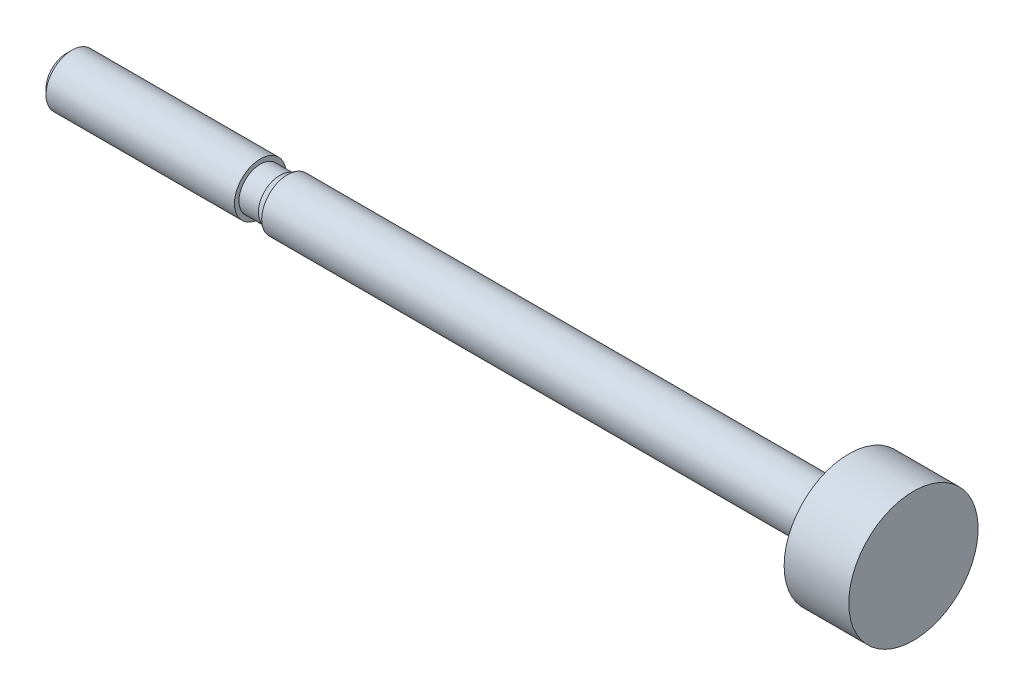
ISO-10303-21;
HEADER;
FILE_DESCRIPTION(('STEP AP214'),'2;1');
FILE_NAME('part.step','',(''),(''),'','','');
FILE_SCHEMA(('AUTOMOTIVE_DESIGN { 1 0 10303 214 1 1 1 1 }'));
ENDSEC;
DATA;
#1=APPLICATION_CONTEXT('core data for automotive mechanical design processes');
#2=APPLICATION_PROTOCOL_DEFINITION('international standard','automotive_design',2000,#1);
#3=PRODUCT_CONTEXT('',#1,'mechanical');
#4=PRODUCT('Part','Part','',(#3));
#5=PRODUCT_RELATED_PRODUCT_CATEGORY('part','',(#4));
#6=PRODUCT_DEFINITION_FORMATION('','',#4);
#7=PRODUCT_DEFINITION_CONTEXT('part definition',#1,'design');
#8=PRODUCT_DEFINITION('design','',#6,#7);
#9=PRODUCT_DEFINITION_SHAPE('','',#8);
#10=(LENGTH_UNIT() NAMED_UNIT(*) SI_UNIT(.MILLI.,.METRE.));
#11=(NAMED_UNIT(*) PLANE_ANGLE_UNIT() SI_UNIT($,.RADIAN.));
#12=(NAMED_UNIT(*) SI_UNIT($,.STERADIAN.) SOLID_ANGLE_UNIT());
#13=UNCERTAINTY_MEASURE_WITH_UNIT(LENGTH_MEASURE(1.E-05),#10,'distance_accuracy_value','');
#14=(GEOMETRIC_REPRESENTATION_CONTEXT(3) GLOBAL_UNCERTAINTY_ASSIGNED_CONTEXT((#13)) GLOBAL_UNIT_ASSIGNED_CONTEXT((#10,
#11,#12)) REPRESENTATION_CONTEXT('',''));
#15=CARTESIAN_POINT('',(0.,0.,0.));
#16=DIRECTION('',(0.,0.,1.));
#17=DIRECTION('',(1.,0.,0.));
#18=AXIS2_PLACEMENT_3D('',#15,#16,#17);
#19=CARTESIAN_POINT('',(0.,0.,0.));
#20=DIRECTION('',(1.,0.,0.));
#21=DIRECTION('',(0.,0.,-1.));
#22=AXIS2_PLACEMENT_3D('',#19,#20,#21);
#23=PLANE('',#22);
#24=CARTESIAN_POINT('',(0.,0.,0.));
#25=DIRECTION('',(-1.,0.,0.));
#26=DIRECTION('',(0.,0.,1.));
#27=AXIS2_PLACEMENT_3D('',#24,#25,#26);
#28=CIRCLE('',#27,1.5705);
#29=CARTESIAN_POINT('',(0.,0.,1.5705));
#30=VERTEX_POINT('',#29);
#31=EDGE_CURVE('E10',#30,#30,#28,.T.);
#32=ORIENTED_EDGE('',*,*,#31,.T.);
#33=EDGE_LOOP('',(#32));
#34=FACE_BOUND('',#33,.T.);
#35=ADVANCED_FACE('F34',(#34),#23,.F.);
#36=CARTESIAN_POINT('',(0.429499999999999,0.,0.));
#37=DIRECTION('',(1.,0.,0.));
#38=DIRECTION('',(0.,0.,-1.));
#39=AXIS2_PLACEMENT_3D('',#36,#37,#38);
#40=CONICAL_SURFACE('',#39,2.,0.785398163397449);
#41=ORIENTED_EDGE('',*,*,#31,.F.);
#42=EDGE_LOOP('',(#41));
#43=FACE_BOUND('',#42,.T.);
#44=CARTESIAN_POINT('',(0.429499999999999,0.,0.));
#45=DIRECTION('',(-1.,0.,0.));
#46=DIRECTION('',(0.,0.,1.));
#47=AXIS2_PLACEMENT_3D('',#44,#45,#46);
#48=CIRCLE('',#47,2.);
#49=CARTESIAN_POINT('',(0.429499999999999,0.,2.));
#50=VERTEX_POINT('',#49);
#51=EDGE_CURVE('E40',#50,#50,#48,.T.);
#52=ORIENTED_EDGE('',*,*,#51,.T.);
#53=EDGE_LOOP('',(#52));
#54=FACE_BOUND('',#53,.T.);
#55=ADVANCED_FACE('F81',(#43,#54),#40,.T.);
#56=CARTESIAN_POINT('',(65.5,0.,0.));
#57=DIRECTION('',(-1.,0.,0.));
#58=DIRECTION('',(0.,0.,1.));
#59=AXIS2_PLACEMENT_3D('',#56,#57,#58);
#60=CYLINDRICAL_SURFACE('',#59,2.);
#61=ORIENTED_EDGE('',*,*,#51,.F.);
#62=EDGE_LOOP('',(#61));
#63=FACE_BOUND('',#62,.T.);
#64=CARTESIAN_POINT('',(15.,0.,0.));
#65=DIRECTION('',(-1.,0.,0.));
#66=DIRECTION('',(0.,0.,1.));
#67=AXIS2_PLACEMENT_3D('',#64,#65,#66);
#68=CIRCLE('',#67,2.);
#69=CARTESIAN_POINT('',(15.,0.,2.));
#70=VERTEX_POINT('',#69);
#71=EDGE_CURVE('E44',#70,#70,#68,.T.);
#72=ORIENTED_EDGE('',*,*,#71,.T.);
#73=EDGE_LOOP('',(#72));
#74=FACE_BOUND('',#73,.T.);
#75=ADVANCED_FACE('F85',(#63,#74),#60,.T.);
#76=CARTESIAN_POINT('',(15.,2.,0.));
#77=DIRECTION('',(-1.,0.,0.));
#78=DIRECTION('',(0.,0.,1.));
#79=AXIS2_PLACEMENT_3D('',#76,#77,#78);
#80=PLANE('',#79);
#81=ORIENTED_EDGE('',*,*,#71,.F.);
#82=EDGE_LOOP('',(#81));
#83=FACE_BOUND('',#82,.T.);
#84=CARTESIAN_POINT('',(15.,0.,0.));
#85=DIRECTION('',(-1.,0.,0.));
#86=DIRECTION('',(0.,0.,1.));
#87=AXIS2_PLACEMENT_3D('',#84,#85,#86);
#88=CIRCLE('',#87,1.65);
#89=CARTESIAN_POINT('',(15.,0.,1.65));
#90=VERTEX_POINT('',#89);
#91=EDGE_CURVE('E48',#90,#90,#88,.T.);
#92=ORIENTED_EDGE('',*,*,#91,.T.);
#93=EDGE_LOOP('',(#92));
#94=FACE_BOUND('',#93,.T.);
#95=ADVANCED_FACE('F90',(#83,#94),#80,.F.);
#96=CARTESIAN_POINT('',(65.5,0.,0.));
#97=DIRECTION('',(-1.,0.,0.));
#98=DIRECTION('',(0.,0.,1.));
#99=AXIS2_PLACEMENT_3D('',#96,#97,#98);
#100=CYLINDRICAL_SURFACE('',#99,1.65);
#101=ORIENTED_EDGE('',*,*,#91,.F.);
#102=EDGE_LOOP('',(#101));
#103=FACE_BOUND('',#102,.T.);
#104=CARTESIAN_POINT('',(16.5,0.,0.));
#105=DIRECTION('',(-1.,0.,0.));
#106=DIRECTION('',(0.,0.,1.));
#107=AXIS2_PLACEMENT_3D('',#104,#105,#106);
#108=CIRCLE('',#107,1.65);
#109=CARTESIAN_POINT('',(16.5,0.,1.65));
#110=VERTEX_POINT('',#109);
#111=EDGE_CURVE('E53',#110,#110,#108,.T.);
#112=ORIENTED_EDGE('',*,*,#111,.T.);
#113=EDGE_LOOP('',(#112));
#114=FACE_BOUND('',#113,.T.);
#115=ADVANCED_FACE('F96',(#103,#114),#100,.T.);
#116=CARTESIAN_POINT('',(17.106217782649,0.,0.));
#117=DIRECTION('',(1.,0.,0.));
#118=DIRECTION('',(0.,0.,-1.));
#119=AXIS2_PLACEMENT_3D('',#116,#117,#118);
#120=CONICAL_SURFACE('',#119,2.,0.523598775598375);
#121=ORIENTED_EDGE('',*,*,#111,.F.);
#122=EDGE_LOOP('',(#121));
#123=FACE_BOUND('',#122,.T.);
#124=CARTESIAN_POINT('',(17.106217782649,0.,0.));
#125=DIRECTION('',(-1.,0.,0.));
#126=DIRECTION('',(0.,0.,1.));
#127=AXIS2_PLACEMENT_3D('',#124,#125,#126);
#128=CIRCLE('',#127,2.);
#129=CARTESIAN_POINT('',(17.106217782649,0.,2.));
#130=VERTEX_POINT('',#129);
#131=EDGE_CURVE('E56',#130,#130,#128,.T.);
#132=ORIENTED_EDGE('',*,*,#131,.T.);
#133=EDGE_LOOP('',(#132));
#134=FACE_BOUND('',#133,.T.);
#135=ADVANCED_FACE('F100',(#123,#134),#120,.T.);
#136=CARTESIAN_POINT('',(65.5,0.,0.));
#137=DIRECTION('',(-1.,0.,0.));
#138=DIRECTION('',(0.,0.,1.));
#139=AXIS2_PLACEMENT_3D('',#136,#137,#138);
#140=CYLINDRICAL_SURFACE('',#139,2.);
#141=ORIENTED_EDGE('',*,*,#131,.F.);
#142=EDGE_LOOP('',(#141));
#143=FACE_BOUND('',#142,.T.);
#144=CARTESIAN_POINT('',(60.5,0.,0.));
#145=DIRECTION('',(-1.,0.,0.));
#146=DIRECTION('',(0.,0.,1.));
#147=AXIS2_PLACEMENT_3D('',#144,#145,#146);
#148=CIRCLE('',#147,2.);
#149=CARTESIAN_POINT('',(60.5,0.,2.));
#150=VERTEX_POINT('',#149);
#151=EDGE_CURVE('E59',#150,#150,#148,.T.);
#152=ORIENTED_EDGE('',*,*,#151,.T.);
#153=EDGE_LOOP('',(#152));
#154=FACE_BOUND('',#153,.T.);
#155=ADVANCED_FACE('F104',(#143,#154),#140,.T.);
#156=CARTESIAN_POINT('',(60.5,2.,0.));
#157=DIRECTION('',(1.,0.,0.));
#158=DIRECTION('',(0.,0.,-1.));
#159=AXIS2_PLACEMENT_3D('',#156,#157,#158);
#160=PLANE('',#159);
#161=ORIENTED_EDGE('',*,*,#151,.F.);
#162=EDGE_LOOP('',(#161));
#163=FACE_BOUND('',#162,.T.);
#164=CARTESIAN_POINT('',(60.5,0.,0.));
#165=DIRECTION('',(-1.,0.,0.));
#166=DIRECTION('',(0.,0.,1.));
#167=AXIS2_PLACEMENT_3D('',#164,#165,#166);
#168=CIRCLE('',#167,5.);
#169=CARTESIAN_POINT('',(60.5,0.,5.));
#170=VERTEX_POINT('',#169);
#171=EDGE_CURVE('E62',#170,#170,#168,.T.);
#172=ORIENTED_EDGE('',*,*,#171,.T.);
#173=EDGE_LOOP('',(#172));
#174=FACE_BOUND('',#173,.T.);
#175=ADVANCED_FACE('F77',(#163,#174),#160,.F.);
#176=CARTESIAN_POINT('',(65.5,0.,0.));
#177=DIRECTION('',(-1.,0.,0.));
#178=DIRECTION('',(0.,0.,1.));
#179=AXIS2_PLACEMENT_3D('',#176,#177,#178);
#180=CYLINDRICAL_SURFACE('',#179,5.);
#181=ORIENTED_EDGE('',*,*,#171,.F.);
#182=EDGE_LOOP('',(#181));
#183=FACE_BOUND('',#182,.T.);
#184=CARTESIAN_POINT('',(65.5,0.,0.));
#185=DIRECTION('',(-1.,0.,0.));
#186=DIRECTION('',(0.,0.,1.));
#187=AXIS2_PLACEMENT_3D('',#184,#185,#186);
#188=CIRCLE('',#187,5.);
#189=CARTESIAN_POINT('',(65.5,0.,5.));
#190=VERTEX_POINT('',#189);
#191=EDGE_CURVE('E65',#190,#190,#188,.T.);
#192=ORIENTED_EDGE('',*,*,#191,.T.);
#193=EDGE_LOOP('',(#192));
#194=FACE_BOUND('',#193,.T.);
#195=ADVANCED_FACE('F69',(#183,#194),#180,.T.);
#196=CARTESIAN_POINT('',(65.5,5.,0.));
#197=DIRECTION('',(-1.,0.,0.));
#198=DIRECTION('',(0.,0.,1.));
#199=AXIS2_PLACEMENT_3D('',#196,#197,#198);
#200=PLANE('',#199);
#201=ORIENTED_EDGE('',*,*,#191,.F.);
#202=EDGE_LOOP('',(#201));
#203=FACE_BOUND('',#202,.T.);
#204=ADVANCED_FACE('F71',(#203),#200,.F.);
#205=CLOSED_SHELL('',(#35,#55,#75,#95,#115,#135,#155,#175,#195,#204));
#206=MANIFOLD_SOLID_BREP('B2',#205);
#207=ADVANCED_BREP_SHAPE_REPRESENTATION('',(#18,#206),#14);
#208=SHAPE_DEFINITION_REPRESENTATION(#9,#207);
ENDSEC;
END-ISO-10303-21;
